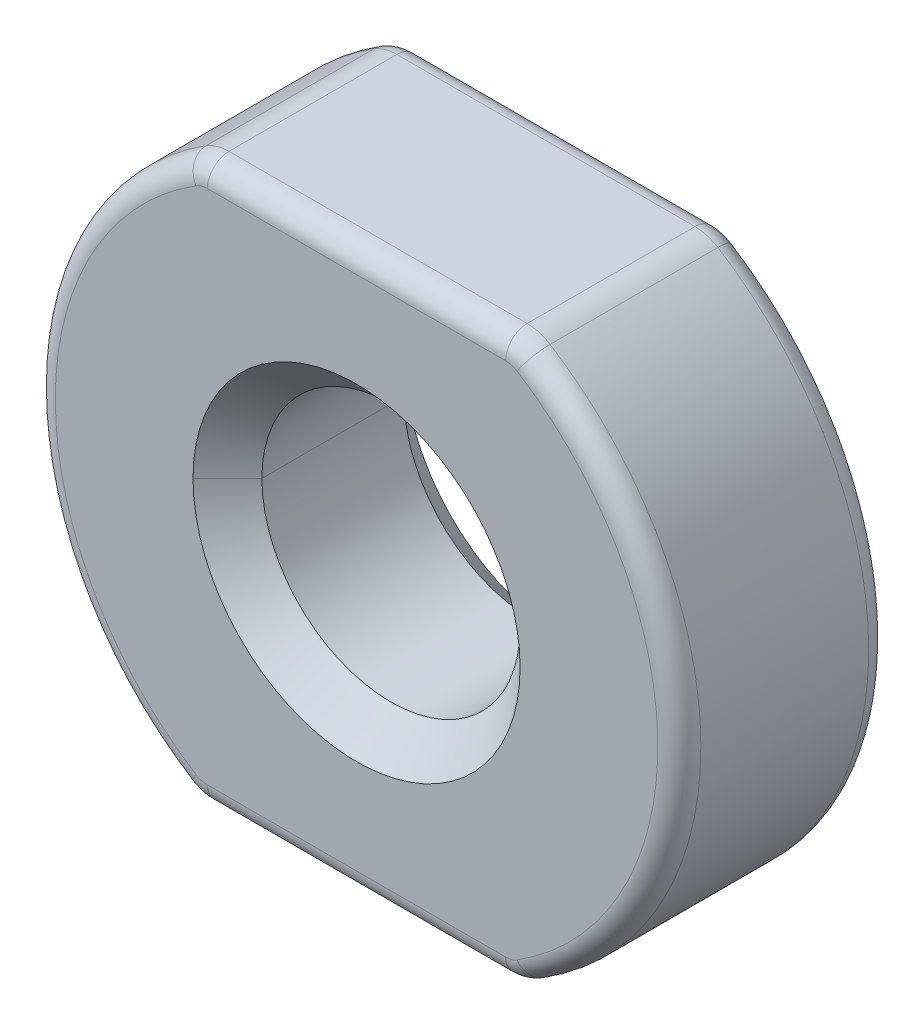
ISO-10303-21;
HEADER;
FILE_DESCRIPTION(('STEP AP214'),'2;1');
FILE_NAME('part.step','',(''),(''),'','','');
FILE_SCHEMA(('AUTOMOTIVE_DESIGN { 1 0 10303 214 1 1 1 1 }'));
ENDSEC;
DATA;
#1=APPLICATION_CONTEXT('core data for automotive mechanical design processes');
#2=APPLICATION_PROTOCOL_DEFINITION('international standard','automotive_design',2000,#1);
#3=PRODUCT_CONTEXT('',#1,'mechanical');
#4=PRODUCT('Part','Part','',(#3));
#5=PRODUCT_RELATED_PRODUCT_CATEGORY('part','',(#4));
#6=PRODUCT_DEFINITION_FORMATION('','',#4);
#7=PRODUCT_DEFINITION_CONTEXT('part definition',#1,'design');
#8=PRODUCT_DEFINITION('design','',#6,#7);
#9=PRODUCT_DEFINITION_SHAPE('','',#8);
#10=(LENGTH_UNIT() NAMED_UNIT(*) SI_UNIT(.MILLI.,.METRE.));
#11=(NAMED_UNIT(*) PLANE_ANGLE_UNIT() SI_UNIT($,.RADIAN.));
#12=(NAMED_UNIT(*) SI_UNIT($,.STERADIAN.) SOLID_ANGLE_UNIT());
#13=UNCERTAINTY_MEASURE_WITH_UNIT(LENGTH_MEASURE(1.E-05),#10,'distance_accuracy_value','');
#14=(GEOMETRIC_REPRESENTATION_CONTEXT(3) GLOBAL_UNCERTAINTY_ASSIGNED_CONTEXT((#13)) GLOBAL_UNIT_ASSIGNED_CONTEXT((#10,
#11,#12)) REPRESENTATION_CONTEXT('',''));
#15=CARTESIAN_POINT('',(0.,0.,0.));
#16=DIRECTION('',(0.,0.,1.));
#17=DIRECTION('',(1.,0.,0.));
#18=AXIS2_PLACEMENT_3D('',#15,#16,#17);
#19=CARTESIAN_POINT('',(-3.46410161513748,-5.49999999999987,0.499999999999376));
#20=DIRECTION('',(0.,0.,1.));
#21=DIRECTION('',(1.,0.,0.));
#22=AXIS2_PLACEMENT_3D('',#19,#20,#21);
#23=TOROIDAL_SURFACE('',#22,0.50000000000024,0.499999999999867);
#24=CARTESIAN_POINT('',(-3.46410161513748,-5.49999999999987,-4.90493062832442E-13));
#25=DIRECTION('',(0.,0.,1.));
#26=DIRECTION('',(1.,0.,0.));
#27=AXIS2_PLACEMENT_3D('',#24,#25,#26);
#28=CIRCLE('',#27,0.500000000000137);
#29=CARTESIAN_POINT('',(-3.73057097014816,-5.923076923077,0.));
#30=VERTEX_POINT('',#29);
#31=CARTESIAN_POINT('',(-3.46410161513774,-6.,-2.45246531416221E-13));
#32=VERTEX_POINT('',#31);
#33=EDGE_CURVE('E85',#30,#32,#28,.T.);
#34=ORIENTED_EDGE('',*,*,#33,.T.);
#35=CARTESIAN_POINT('',(-3.464101615138,-6.,0.5));
#36=DIRECTION('',(1.,0.,0.));
#37=DIRECTION('',(0.,0.,-1.));
#38=AXIS2_PLACEMENT_3D('',#35,#36,#37);
#39=CIRCLE('',#38,0.5);
#40=CARTESIAN_POINT('',(-3.464101615138,-6.5,0.5));
#41=VERTEX_POINT('',#40);
#42=EDGE_CURVE('E517',#41,#32,#39,.T.);
#43=ORIENTED_EDGE('',*,*,#42,.F.);
#44=CARTESIAN_POINT('',(-3.464101615138,-5.5,0.5));
#45=DIRECTION('',(0.,0.,-1.));
#46=DIRECTION('',(-1.,0.,0.));
#47=AXIS2_PLACEMENT_3D('',#44,#45,#46);
#48=CIRCLE('',#47,1.);
#49=CARTESIAN_POINT('',(-3.99704032515886,-6.34615384615394,0.5));
#50=VERTEX_POINT('',#49);
#51=EDGE_CURVE('E666',#50,#41,#48,.F.);
#52=ORIENTED_EDGE('',*,*,#51,.F.);
#53=CARTESIAN_POINT('',(-3.73057097014807,-5.9230769230771,0.5));
#54=DIRECTION('',(0.846153846153872,-0.532938710021153,0.));
#55=DIRECTION('',(-0.532938710021153,-0.846153846153872,0.));
#56=AXIS2_PLACEMENT_3D('',#53,#54,#55);
#57=CIRCLE('',#56,0.5);
#58=EDGE_CURVE('E550',#30,#50,#57,.F.);
#59=ORIENTED_EDGE('',*,*,#58,.F.);
#60=EDGE_LOOP('',(#34,#43,#52,#59));
#61=FACE_BOUND('',#60,.T.);
#62=ADVANCED_FACE('F17',(#61),#23,.T.);
#63=CARTESIAN_POINT('',(3.46410161513748,-5.49999999999987,0.499999999999523));
#64=DIRECTION('',(0.,0.,1.));
#65=DIRECTION('',(1.,0.,0.));
#66=AXIS2_PLACEMENT_3D('',#63,#64,#65);
#67=DEGENERATE_TOROIDAL_SURFACE('',#66,0.499999999999824,0.499999999999901,.T.);
#68=CARTESIAN_POINT('',(3.46410161513748,-5.49999999999987,-3.7773603689395E-13));
#69=DIRECTION('',(0.,0.,1.));
#70=DIRECTION('',(1.,0.,0.));
#71=AXIS2_PLACEMENT_3D('',#68,#69,#70);
#72=CIRCLE('',#71,0.500000000000134);
#73=CARTESIAN_POINT('',(3.46410161513774,-6.,-1.88868018446975E-13));
#74=VERTEX_POINT('',#73);
#75=CARTESIAN_POINT('',(3.7305709701482,-5.92307692307698,0.));
#76=VERTEX_POINT('',#75);
#77=EDGE_CURVE('E76',#74,#76,#72,.T.);
#78=ORIENTED_EDGE('',*,*,#77,.T.);
#79=CARTESIAN_POINT('',(3.73057097014832,-5.92307692307694,0.5));
#80=DIRECTION('',(0.846153846153849,0.532938710021189,0.));
#81=DIRECTION('',(0.532938710021189,-0.846153846153849,0.));
#82=AXIS2_PLACEMENT_3D('',#79,#80,#81);
#83=CIRCLE('',#82,0.5);
#84=CARTESIAN_POINT('',(3.99704032515893,-6.34615384615389,0.5));
#85=VERTEX_POINT('',#84);
#86=EDGE_CURVE('E475',#85,#76,#83,.T.);
#87=ORIENTED_EDGE('',*,*,#86,.F.);
#88=CARTESIAN_POINT('',(3.464101615138,-5.5,0.5));
#89=DIRECTION('',(0.,0.,-1.));
#90=DIRECTION('',(-1.,0.,0.));
#91=AXIS2_PLACEMENT_3D('',#88,#89,#90);
#92=CIRCLE('',#91,1.);
#93=CARTESIAN_POINT('',(3.464101615138,-6.5,0.5));
#94=VERTEX_POINT('',#93);
#95=EDGE_CURVE('E644',#94,#85,#92,.F.);
#96=ORIENTED_EDGE('',*,*,#95,.F.);
#97=CARTESIAN_POINT('',(3.464101615138,-6.,0.5));
#98=DIRECTION('',(1.,0.,0.));
#99=DIRECTION('',(0.,0.,-1.));
#100=AXIS2_PLACEMENT_3D('',#97,#98,#99);
#101=CIRCLE('',#100,0.5);
#102=EDGE_CURVE('E516',#74,#94,#101,.F.);
#103=ORIENTED_EDGE('',*,*,#102,.F.);
#104=EDGE_LOOP('',(#78,#87,#96,#103));
#105=FACE_BOUND('',#104,.T.);
#106=ADVANCED_FACE('F641',(#105),#67,.T.);
#107=CARTESIAN_POINT('',(-3.46410161513748,5.49999999999987,0.499999999999523));
#108=DIRECTION('',(0.,0.,1.));
#109=DIRECTION('',(1.,0.,0.));
#110=AXIS2_PLACEMENT_3D('',#107,#108,#109);
#111=DEGENERATE_TOROIDAL_SURFACE('',#110,0.499999999999824,0.499999999999901,.T.);
#112=CARTESIAN_POINT('',(-3.464101615138,5.5,0.5));
#113=DIRECTION('',(0.,0.,-1.));
#114=DIRECTION('',(-1.,0.,0.));
#115=AXIS2_PLACEMENT_3D('',#112,#113,#114);
#116=CIRCLE('',#115,1.);
#117=CARTESIAN_POINT('',(-3.464101615138,6.5,0.5));
#118=VERTEX_POINT('',#117);
#119=CARTESIAN_POINT('',(-3.99704032515893,6.34615384615389,0.5));
#120=VERTEX_POINT('',#119);
#121=EDGE_CURVE('E474',#118,#120,#116,.F.);
#122=ORIENTED_EDGE('',*,*,#121,.F.);
#123=CARTESIAN_POINT('',(-3.464101615138,6.,0.5));
#124=DIRECTION('',(-1.,0.,0.));
#125=DIRECTION('',(0.,0.,1.));
#126=AXIS2_PLACEMENT_3D('',#123,#124,#125);
#127=CIRCLE('',#126,0.5);
#128=CARTESIAN_POINT('',(-3.46410161513774,6.,-1.88868018446975E-13));
#129=VERTEX_POINT('',#128);
#130=EDGE_CURVE('E464',#129,#118,#127,.F.);
#131=ORIENTED_EDGE('',*,*,#130,.F.);
#132=CARTESIAN_POINT('',(-3.46410161513748,5.49999999999987,-3.7773603689395E-13));
#133=DIRECTION('',(0.,0.,1.));
#134=DIRECTION('',(1.,0.,0.));
#135=AXIS2_PLACEMENT_3D('',#132,#133,#134);
#136=CIRCLE('',#135,0.500000000000134);
#137=CARTESIAN_POINT('',(-3.73057097014815,5.92307692307701,0.));
#138=VERTEX_POINT('',#137);
#139=EDGE_CURVE('E601',#129,#138,#136,.T.);
#140=ORIENTED_EDGE('',*,*,#139,.T.);
#141=CARTESIAN_POINT('',(-3.73057097014832,5.92307692307694,0.5));
#142=DIRECTION('',(-0.846153846153849,-0.532938710021189,0.));
#143=DIRECTION('',(-0.532938710021189,0.846153846153849,0.));
#144=AXIS2_PLACEMENT_3D('',#141,#142,#143);
#145=CIRCLE('',#144,0.5);
#146=EDGE_CURVE('E552',#120,#138,#145,.T.);
#147=ORIENTED_EDGE('',*,*,#146,.F.);
#148=EDGE_LOOP('',(#122,#131,#140,#147));
#149=FACE_BOUND('',#148,.T.);
#150=ADVANCED_FACE('F604',(#149),#111,.T.);
#151=CARTESIAN_POINT('',(3.46410161513748,5.49999999999987,0.499999999999376));
#152=DIRECTION('',(0.,0.,1.));
#153=DIRECTION('',(1.,0.,0.));
#154=AXIS2_PLACEMENT_3D('',#151,#152,#153);
#155=TOROIDAL_SURFACE('',#154,0.50000000000024,0.499999999999867);
#156=CARTESIAN_POINT('',(3.464101615138,5.5,0.5));
#157=DIRECTION('',(0.,0.,-1.));
#158=DIRECTION('',(-1.,0.,0.));
#159=AXIS2_PLACEMENT_3D('',#156,#157,#158);
#160=CIRCLE('',#159,1.);
#161=CARTESIAN_POINT('',(3.99704032515886,6.34615384615394,0.5));
#162=VERTEX_POINT('',#161);
#163=CARTESIAN_POINT('',(3.464101615138,6.5,0.5));
#164=VERTEX_POINT('',#163);
#165=EDGE_CURVE('E450',#162,#164,#160,.F.);
#166=ORIENTED_EDGE('',*,*,#165,.F.);
#167=CARTESIAN_POINT('',(3.73057097014807,5.9230769230771,0.5));
#168=DIRECTION('',(-0.846153846153872,0.532938710021152,0.));
#169=DIRECTION('',(0.532938710021152,0.846153846153872,0.));
#170=AXIS2_PLACEMENT_3D('',#167,#168,#169);
#171=CIRCLE('',#170,0.5);
#172=CARTESIAN_POINT('',(3.7305709701481,5.92307692307699,0.));
#173=VERTEX_POINT('',#172);
#174=EDGE_CURVE('E488',#173,#162,#171,.F.);
#175=ORIENTED_EDGE('',*,*,#174,.F.);
#176=CARTESIAN_POINT('',(3.46410161513748,5.49999999999987,-4.90493062832442E-13));
#177=DIRECTION('',(0.,0.,1.));
#178=DIRECTION('',(1.,0.,0.));
#179=AXIS2_PLACEMENT_3D('',#176,#177,#178);
#180=CIRCLE('',#179,0.500000000000137);
#181=CARTESIAN_POINT('',(3.46410161513774,6.,-2.45246531416221E-13));
#182=VERTEX_POINT('',#181);
#183=EDGE_CURVE('E599',#173,#182,#180,.T.);
#184=ORIENTED_EDGE('',*,*,#183,.T.);
#185=CARTESIAN_POINT('',(3.464101615138,6.,0.5));
#186=DIRECTION('',(-1.,0.,0.));
#187=DIRECTION('',(0.,0.,1.));
#188=AXIS2_PLACEMENT_3D('',#185,#186,#187);
#189=CIRCLE('',#188,0.5);
#190=EDGE_CURVE('E451',#164,#182,#189,.T.);
#191=ORIENTED_EDGE('',*,*,#190,.F.);
#192=EDGE_LOOP('',(#166,#175,#184,#191));
#193=FACE_BOUND('',#192,.T.);
#194=ADVANCED_FACE('F712',(#193),#155,.T.);
#195=CARTESIAN_POINT('',(0.,0.,0.));
#196=DIRECTION('',(0.,0.,1.));
#197=DIRECTION('',(1.,0.,0.));
#198=AXIS2_PLACEMENT_3D('',#195,#196,#197);
#199=PLANE('',#198);
#200=CARTESIAN_POINT('',(0.,0.,0.));
#201=DIRECTION('',(0.,0.,-1.));
#202=DIRECTION('',(-1.,0.,0.));
#203=AXIS2_PLACEMENT_3D('',#200,#201,#202);
#204=CIRCLE('',#203,3.80000000001246);
#205=CARTESIAN_POINT('',(3.80000000001246,0.,0.));
#206=VERTEX_POINT('',#205);
#207=CARTESIAN_POINT('',(-3.80000000001246,0.,0.));
#208=VERTEX_POINT('',#207);
#209=EDGE_CURVE('E445',#206,#208,#204,.F.);
#210=ORIENTED_EDGE('',*,*,#209,.T.);
#211=CARTESIAN_POINT('',(0.,0.,0.));
#212=DIRECTION('',(0.,0.,-1.));
#213=DIRECTION('',(-1.,0.,0.));
#214=AXIS2_PLACEMENT_3D('',#211,#212,#213);
#215=CIRCLE('',#214,3.80000000001246);
#216=EDGE_CURVE('E439',#208,#206,#215,.F.);
#217=ORIENTED_EDGE('',*,*,#216,.T.);
#218=EDGE_LOOP('',(#210,#217));
#219=FACE_BOUND('',#218,.T.);
#220=CARTESIAN_POINT('',(0.,0.,0.));
#221=DIRECTION('',(0.,0.,1.));
#222=DIRECTION('',(-0.532938710021177,0.846153846153856,0.));
#223=AXIS2_PLACEMENT_3D('',#220,#221,#222);
#224=CIRCLE('',#223,6.99999999999988);
#225=CARTESIAN_POINT('',(-7.,0.,0.));
#226=VERTEX_POINT('',#225);
#227=EDGE_CURVE('E576',#138,#226,#224,.T.);
#228=ORIENTED_EDGE('',*,*,#227,.F.);
#229=ORIENTED_EDGE('',*,*,#139,.F.);
#230=DIRECTION('',(-1.,0.,0.));
#231=VECTOR('',#230,1.);
#232=CARTESIAN_POINT('',(-3.741657386774,6.,0.));
#233=LINE('',#232,#231);
#234=EDGE_CURVE('E469',#182,#129,#233,.T.);
#235=ORIENTED_EDGE('',*,*,#234,.F.);
#236=ORIENTED_EDGE('',*,*,#183,.F.);
#237=CARTESIAN_POINT('',(0.,0.,0.));
#238=DIRECTION('',(0.,0.,1.));
#239=DIRECTION('',(0.532938710021187,-0.84615384615385,0.));
#240=AXIS2_PLACEMENT_3D('',#237,#238,#239);
#241=CIRCLE('',#240,6.99999999999988);
#242=EDGE_CURVE('E564',#76,#173,#241,.T.);
#243=ORIENTED_EDGE('',*,*,#242,.F.);
#244=ORIENTED_EDGE('',*,*,#77,.F.);
#245=DIRECTION('',(1.,0.,0.));
#246=VECTOR('',#245,1.);
#247=CARTESIAN_POINT('',(-3.741657386774,-6.,0.));
#248=LINE('',#247,#246);
#249=EDGE_CURVE('E508',#32,#74,#248,.T.);
#250=ORIENTED_EDGE('',*,*,#249,.F.);
#251=ORIENTED_EDGE('',*,*,#33,.F.);
#252=CARTESIAN_POINT('',(0.,0.,0.));
#253=DIRECTION('',(0.,0.,1.));
#254=DIRECTION('',(-1.,0.,0.));
#255=AXIS2_PLACEMENT_3D('',#252,#253,#254);
#256=CIRCLE('',#255,7.);
#257=EDGE_CURVE('E523',#226,#30,#256,.T.);
#258=ORIENTED_EDGE('',*,*,#257,.F.);
#259=EDGE_LOOP('',(#228,#229,#235,#236,#243,#244,#250,#251,#258));
#260=FACE_BOUND('',#259,.T.);
#261=ADVANCED_FACE('F541',(#219,#260),#199,.F.);
#262=CARTESIAN_POINT('',(0.,0.,0.5));
#263=DIRECTION('',(0.,0.,1.));
#264=DIRECTION('',(1.,0.,0.));
#265=AXIS2_PLACEMENT_3D('',#262,#263,#264);
#266=TOROIDAL_SURFACE('',#265,7.,0.5);
#267=CARTESIAN_POINT('',(0.,0.,0.5));
#268=DIRECTION('',(0.,0.,-1.));
#269=DIRECTION('',(-1.,0.,0.));
#270=AXIS2_PLACEMENT_3D('',#267,#268,#269);
#271=CIRCLE('',#270,7.5);
#272=CARTESIAN_POINT('',(-7.5,0.,0.5));
#273=VERTEX_POINT('',#272);
#274=EDGE_CURVE('E427',#120,#273,#271,.F.);
#275=ORIENTED_EDGE('',*,*,#274,.F.);
#276=ORIENTED_EDGE('',*,*,#146,.T.);
#277=ORIENTED_EDGE('',*,*,#227,.T.);
#278=ORIENTED_EDGE('',*,*,#257,.T.);
#279=ORIENTED_EDGE('',*,*,#58,.T.);
#280=CARTESIAN_POINT('',(0.,0.,0.5));
#281=DIRECTION('',(0.,0.,-1.));
#282=DIRECTION('',(-1.,0.,0.));
#283=AXIS2_PLACEMENT_3D('',#280,#281,#282);
#284=CIRCLE('',#283,7.5);
#285=EDGE_CURVE('E421',#273,#50,#284,.F.);
#286=ORIENTED_EDGE('',*,*,#285,.F.);
#287=EDGE_LOOP('',(#275,#276,#277,#278,#279,#286));
#288=FACE_BOUND('',#287,.T.);
#289=ADVANCED_FACE('F529',(#288),#266,.T.);
#290=CARTESIAN_POINT('',(-3.741657386774,-6.,0.5));
#291=DIRECTION('',(1.,0.,0.));
#292=DIRECTION('',(0.,0.,-1.));
#293=AXIS2_PLACEMENT_3D('',#290,#291,#292);
#294=CYLINDRICAL_SURFACE('',#293,0.5);
#295=ORIENTED_EDGE('',*,*,#249,.T.);
#296=ORIENTED_EDGE('',*,*,#102,.T.);
#297=DIRECTION('',(1.,0.,0.));
#298=VECTOR('',#297,1.);
#299=CARTESIAN_POINT('',(-3.741657386774,-6.5,0.5));
#300=LINE('',#299,#298);
#301=EDGE_CURVE('E408',#94,#41,#300,.F.);
#302=ORIENTED_EDGE('',*,*,#301,.T.);
#303=ORIENTED_EDGE('',*,*,#42,.T.);
#304=EDGE_LOOP('',(#295,#296,#302,#303));
#305=FACE_BOUND('',#304,.T.);
#306=ADVANCED_FACE('F540',(#305),#294,.T.);
#307=CARTESIAN_POINT('',(-3.464101615138,-5.5,4.9));
#308=DIRECTION('',(0.,0.,-1.));
#309=DIRECTION('',(-1.,0.,0.));
#310=AXIS2_PLACEMENT_3D('',#307,#308,#309);
#311=CYLINDRICAL_SURFACE('',#310,1.);
#312=ORIENTED_EDGE('',*,*,#51,.T.);
#313=DIRECTION('',(0.,0.,1.));
#314=VECTOR('',#313,1.);
#315=CARTESIAN_POINT('',(-3.464101615138,-6.5,4.9));
#316=LINE('',#315,#314);
#317=CARTESIAN_POINT('',(-3.464101615138,-6.5,4.4));
#318=VERTEX_POINT('',#317);
#319=EDGE_CURVE('E398',#41,#318,#316,.T.);
#320=ORIENTED_EDGE('',*,*,#319,.T.);
#321=CARTESIAN_POINT('',(-3.464101615138,-5.5,4.4));
#322=DIRECTION('',(0.,0.,-1.));
#323=DIRECTION('',(-1.,0.,0.));
#324=AXIS2_PLACEMENT_3D('',#321,#322,#323);
#325=CIRCLE('',#324,1.);
#326=CARTESIAN_POINT('',(-3.99704032515865,-6.3461538461542,4.4));
#327=VERTEX_POINT('',#326);
#328=EDGE_CURVE('E648',#318,#327,#325,.T.);
#329=ORIENTED_EDGE('',*,*,#328,.T.);
#330=DIRECTION('',(0.,0.,-1.));
#331=VECTOR('',#330,1.);
#332=CARTESIAN_POINT('',(-3.99704032515892,-6.34615384615387,4.9));
#333=LINE('',#332,#331);
#334=EDGE_CURVE('E409',#50,#327,#333,.F.);
#335=ORIENTED_EDGE('',*,*,#334,.F.);
#336=EDGE_LOOP('',(#312,#320,#329,#335));
#337=FACE_BOUND('',#336,.T.);
#338=ADVANCED_FACE('F665',(#337),#311,.T.);
#339=CARTESIAN_POINT('',(3.464101615138,-5.5,4.9));
#340=DIRECTION('',(0.,0.,-1.));
#341=DIRECTION('',(-1.,0.,0.));
#342=AXIS2_PLACEMENT_3D('',#339,#340,#341);
#343=CYLINDRICAL_SURFACE('',#342,1.);
#344=ORIENTED_EDGE('',*,*,#95,.T.);
#345=DIRECTION('',(0.,0.,-1.));
#346=VECTOR('',#345,1.);
#347=CARTESIAN_POINT('',(3.99704032515892,-6.34615384615387,4.9));
#348=LINE('',#347,#346);
#349=CARTESIAN_POINT('',(3.9970403251588,-6.34615384615398,4.4));
#350=VERTEX_POINT('',#349);
#351=EDGE_CURVE('E394',#350,#85,#348,.T.);
#352=ORIENTED_EDGE('',*,*,#351,.F.);
#353=CARTESIAN_POINT('',(3.464101615138,-5.5,4.4));
#354=DIRECTION('',(0.,0.,-1.));
#355=DIRECTION('',(-1.,0.,0.));
#356=AXIS2_PLACEMENT_3D('',#353,#354,#355);
#357=CIRCLE('',#356,1.);
#358=CARTESIAN_POINT('',(3.46410161513785,-6.50000000000008,4.4));
#359=VERTEX_POINT('',#358);
#360=EDGE_CURVE('E671',#350,#359,#357,.T.);
#361=ORIENTED_EDGE('',*,*,#360,.T.);
#362=DIRECTION('',(0.,0.,1.));
#363=VECTOR('',#362,1.);
#364=CARTESIAN_POINT('',(3.464101615138,-6.5,4.9));
#365=LINE('',#364,#363);
#366=EDGE_CURVE('E405',#359,#94,#365,.F.);
#367=ORIENTED_EDGE('',*,*,#366,.T.);
#368=EDGE_LOOP('',(#344,#352,#361,#367));
#369=FACE_BOUND('',#368,.T.);
#370=ADVANCED_FACE('F497',(#369),#343,.T.);
#371=CARTESIAN_POINT('',(0.,0.,0.5));
#372=DIRECTION('',(0.,0.,1.));
#373=DIRECTION('',(1.,0.,0.));
#374=AXIS2_PLACEMENT_3D('',#371,#372,#373);
#375=TOROIDAL_SURFACE('',#374,7.,0.5);
#376=CARTESIAN_POINT('',(0.,0.,0.5));
#377=DIRECTION('',(0.,0.,-1.));
#378=DIRECTION('',(-1.,0.,0.));
#379=AXIS2_PLACEMENT_3D('',#376,#377,#378);
#380=CIRCLE('',#379,7.5);
#381=CARTESIAN_POINT('',(7.5,0.,0.5));
#382=VERTEX_POINT('',#381);
#383=EDGE_CURVE('E397',#85,#382,#380,.F.);
#384=ORIENTED_EDGE('',*,*,#383,.F.);
#385=ORIENTED_EDGE('',*,*,#86,.T.);
#386=ORIENTED_EDGE('',*,*,#242,.T.);
#387=ORIENTED_EDGE('',*,*,#174,.T.);
#388=CARTESIAN_POINT('',(0.,0.,0.5));
#389=DIRECTION('',(0.,0.,-1.));
#390=DIRECTION('',(-1.,0.,0.));
#391=AXIS2_PLACEMENT_3D('',#388,#389,#390);
#392=CIRCLE('',#391,7.5);
#393=EDGE_CURVE('E391',#382,#162,#392,.F.);
#394=ORIENTED_EDGE('',*,*,#393,.F.);
#395=EDGE_LOOP('',(#384,#385,#386,#387,#394));
#396=FACE_BOUND('',#395,.T.);
#397=ADVANCED_FACE('F491',(#396),#375,.T.);
#398=CARTESIAN_POINT('',(-3.464101615138,5.5,4.9));
#399=DIRECTION('',(0.,0.,-1.));
#400=DIRECTION('',(-1.,0.,0.));
#401=AXIS2_PLACEMENT_3D('',#398,#399,#400);
#402=CYLINDRICAL_SURFACE('',#401,1.);
#403=ORIENTED_EDGE('',*,*,#121,.T.);
#404=DIRECTION('',(0.,0.,-1.));
#405=VECTOR('',#404,1.);
#406=CARTESIAN_POINT('',(-3.99704032515892,6.34615384615387,4.9));
#407=LINE('',#406,#405);
#408=CARTESIAN_POINT('',(-3.99704032515895,6.34615384615401,4.4));
#409=VERTEX_POINT('',#408);
#410=EDGE_CURVE('E424',#409,#120,#407,.T.);
#411=ORIENTED_EDGE('',*,*,#410,.F.);
#412=CARTESIAN_POINT('',(-3.464101615138,5.5,4.4));
#413=DIRECTION('',(0.,0.,-1.));
#414=DIRECTION('',(-1.,0.,0.));
#415=AXIS2_PLACEMENT_3D('',#412,#413,#414);
#416=CIRCLE('',#415,1.);
#417=CARTESIAN_POINT('',(-3.46410161513785,6.50000000000008,4.4));
#418=VERTEX_POINT('',#417);
#419=EDGE_CURVE('E472',#409,#418,#416,.T.);
#420=ORIENTED_EDGE('',*,*,#419,.T.);
#421=DIRECTION('',(0.,0.,-1.));
#422=VECTOR('',#421,1.);
#423=CARTESIAN_POINT('',(-3.464101615138,6.5,4.9));
#424=LINE('',#423,#422);
#425=EDGE_CURVE('E375',#418,#118,#424,.T.);
#426=ORIENTED_EDGE('',*,*,#425,.T.);
#427=EDGE_LOOP('',(#403,#411,#420,#426));
#428=FACE_BOUND('',#427,.T.);
#429=ADVANCED_FACE('F496',(#428),#402,.T.);
#430=CARTESIAN_POINT('',(-3.741657386774,6.,0.5));
#431=DIRECTION('',(-1.,0.,0.));
#432=DIRECTION('',(0.,0.,1.));
#433=AXIS2_PLACEMENT_3D('',#430,#431,#432);
#434=CYLINDRICAL_SURFACE('',#433,0.5);
#435=DIRECTION('',(1.,0.,0.));
#436=VECTOR('',#435,1.);
#437=CARTESIAN_POINT('',(-3.741657386774,6.5,0.5));
#438=LINE('',#437,#436);
#439=EDGE_CURVE('E372',#118,#164,#438,.T.);
#440=ORIENTED_EDGE('',*,*,#439,.T.);
#441=ORIENTED_EDGE('',*,*,#190,.T.);
#442=ORIENTED_EDGE('',*,*,#234,.T.);
#443=ORIENTED_EDGE('',*,*,#130,.T.);
#444=EDGE_LOOP('',(#440,#441,#442,#443));
#445=FACE_BOUND('',#444,.T.);
#446=ADVANCED_FACE('F596',(#445),#434,.T.);
#447=CARTESIAN_POINT('',(3.464101615138,5.5,4.9));
#448=DIRECTION('',(0.,0.,-1.));
#449=DIRECTION('',(-1.,0.,0.));
#450=AXIS2_PLACEMENT_3D('',#447,#448,#449);
#451=CYLINDRICAL_SURFACE('',#450,1.);
#452=ORIENTED_EDGE('',*,*,#165,.T.);
#453=DIRECTION('',(0.,0.,-1.));
#454=VECTOR('',#453,1.);
#455=CARTESIAN_POINT('',(3.464101615138,6.5,4.9));
#456=LINE('',#455,#454);
#457=CARTESIAN_POINT('',(3.464101615138,6.5,4.4));
#458=VERTEX_POINT('',#457);
#459=EDGE_CURVE('E369',#164,#458,#456,.F.);
#460=ORIENTED_EDGE('',*,*,#459,.T.);
#461=CARTESIAN_POINT('',(3.464101615138,5.5,4.4));
#462=DIRECTION('',(0.,0.,-1.));
#463=DIRECTION('',(-1.,0.,0.));
#464=AXIS2_PLACEMENT_3D('',#461,#462,#463);
#465=CIRCLE('',#464,1.);
#466=CARTESIAN_POINT('',(3.99704032515865,6.3461538461542,4.4));
#467=VERTEX_POINT('',#466);
#468=EDGE_CURVE('E448',#458,#467,#465,.T.);
#469=ORIENTED_EDGE('',*,*,#468,.T.);
#470=DIRECTION('',(0.,0.,-1.));
#471=VECTOR('',#470,1.);
#472=CARTESIAN_POINT('',(3.99704032515892,6.34615384615387,4.9));
#473=LINE('',#472,#471);
#474=EDGE_CURVE('E378',#162,#467,#473,.F.);
#475=ORIENTED_EDGE('',*,*,#474,.F.);
#476=EDGE_LOOP('',(#452,#460,#469,#475));
#477=FACE_BOUND('',#476,.T.);
#478=ADVANCED_FACE('F700',(#477),#451,.T.);
#479=CARTESIAN_POINT('',(0.,0.,0.));
#480=DIRECTION('',(0.,0.,-1.));
#481=DIRECTION('',(-1.,0.,0.));
#482=AXIS2_PLACEMENT_3D('',#479,#480,#481);
#483=CONICAL_SURFACE('',#482,3.80000000001246,0.785398163397448);
#484=ORIENTED_EDGE('',*,*,#209,.F.);
#485=DIRECTION('',(-0.707106781186443,0.,0.707106781186652));
#486=VECTOR('',#485,1.);
#487=CARTESIAN_POINT('',(499000.,6.11078570557366E-11,-498996.200000148));
#488=LINE('',#487,#486);
#489=CARTESIAN_POINT('',(3.00000000001069,0.,0.799999999992429));
#490=VERTEX_POINT('',#489);
#491=EDGE_CURVE('E428',#206,#490,#488,.T.);
#492=ORIENTED_EDGE('',*,*,#491,.T.);
#493=CARTESIAN_POINT('',(0.,0.,0.8));
#494=DIRECTION('',(0.,0.,-1.));
#495=DIRECTION('',(-1.,0.,0.));
#496=AXIS2_PLACEMENT_3D('',#493,#494,#495);
#497=CIRCLE('',#496,3.);
#498=CARTESIAN_POINT('',(-3.00000000001069,0.,0.799999999992429));
#499=VERTEX_POINT('',#498);
#500=EDGE_CURVE('E358',#490,#499,#497,.F.);
#501=ORIENTED_EDGE('',*,*,#500,.T.);
#502=DIRECTION('',(0.707106781186443,0.,0.707106781186652));
#503=VECTOR('',#502,1.);
#504=CARTESIAN_POINT('',(-499000.,0.,-498996.200000148));
#505=LINE('',#504,#503);
#506=EDGE_CURVE('E442',#499,#208,#505,.F.);
#507=ORIENTED_EDGE('',*,*,#506,.T.);
#508=EDGE_LOOP('',(#484,#492,#501,#507));
#509=FACE_BOUND('',#508,.T.);
#510=ADVANCED_FACE('F793',(#509),#483,.F.);
#511=CARTESIAN_POINT('',(0.,0.,0.));
#512=DIRECTION('',(0.,0.,-1.));
#513=DIRECTION('',(-1.,0.,0.));
#514=AXIS2_PLACEMENT_3D('',#511,#512,#513);
#515=CONICAL_SURFACE('',#514,3.80000000001246,0.785398163397448);
#516=ORIENTED_EDGE('',*,*,#216,.F.);
#517=ORIENTED_EDGE('',*,*,#506,.F.);
#518=CARTESIAN_POINT('',(0.,0.,0.8));
#519=DIRECTION('',(0.,0.,-1.));
#520=DIRECTION('',(-1.,0.,0.));
#521=AXIS2_PLACEMENT_3D('',#518,#519,#520);
#522=CIRCLE('',#521,3.);
#523=EDGE_CURVE('E352',#499,#490,#522,.F.);
#524=ORIENTED_EDGE('',*,*,#523,.T.);
#525=ORIENTED_EDGE('',*,*,#491,.F.);
#526=EDGE_LOOP('',(#516,#517,#524,#525));
#527=FACE_BOUND('',#526,.T.);
#528=ADVANCED_FACE('F801',(#527),#515,.F.);
#529=CARTESIAN_POINT('',(0.,0.,4.9));
#530=DIRECTION('',(0.,0.,-1.));
#531=DIRECTION('',(-1.,0.,0.));
#532=AXIS2_PLACEMENT_3D('',#529,#530,#531);
#533=CYLINDRICAL_SURFACE('',#532,7.5);
#534=ORIENTED_EDGE('',*,*,#285,.T.);
#535=ORIENTED_EDGE('',*,*,#334,.T.);
#536=CARTESIAN_POINT('',(0.,0.,4.4));
#537=DIRECTION('',(0.,0.,1.));
#538=DIRECTION('',(1.,0.,0.));
#539=AXIS2_PLACEMENT_3D('',#536,#537,#538);
#540=CIRCLE('',#539,7.5);
#541=CARTESIAN_POINT('',(-7.5,0.,4.4));
#542=VERTEX_POINT('',#541);
#543=EDGE_CURVE('E321',#542,#327,#540,.T.);
#544=ORIENTED_EDGE('',*,*,#543,.F.);
#545=CARTESIAN_POINT('',(0.,0.,4.4));
#546=DIRECTION('',(0.,0.,1.));
#547=DIRECTION('',(1.,0.,0.));
#548=AXIS2_PLACEMENT_3D('',#545,#546,#547);
#549=CIRCLE('',#548,7.5);
#550=EDGE_CURVE('E351',#409,#542,#549,.T.);
#551=ORIENTED_EDGE('',*,*,#550,.F.);
#552=ORIENTED_EDGE('',*,*,#410,.T.);
#553=ORIENTED_EDGE('',*,*,#274,.T.);
#554=EDGE_LOOP('',(#534,#535,#544,#551,#552,#553));
#555=FACE_BOUND('',#554,.T.);
#556=ADVANCED_FACE('F662',(#555),#533,.T.);
#557=CARTESIAN_POINT('',(-3.741657386774,-6.5,4.9));
#558=DIRECTION('',(0.,1.,0.));
#559=DIRECTION('',(0.,0.,1.));
#560=AXIS2_PLACEMENT_3D('',#557,#558,#559);
#561=PLANE('',#560);
#562=ORIENTED_EDGE('',*,*,#319,.F.);
#563=ORIENTED_EDGE('',*,*,#301,.F.);
#564=ORIENTED_EDGE('',*,*,#366,.F.);
#565=DIRECTION('',(-1.,0.,0.));
#566=VECTOR('',#565,1.);
#567=CARTESIAN_POINT('',(0.,-6.5,4.4));
#568=LINE('',#567,#566);
#569=EDGE_CURVE('E312',#318,#359,#568,.F.);
#570=ORIENTED_EDGE('',*,*,#569,.F.);
#571=EDGE_LOOP('',(#562,#563,#564,#570));
#572=FACE_BOUND('',#571,.T.);
#573=ADVANCED_FACE('F818',(#572),#561,.F.);
#574=CARTESIAN_POINT('',(0.,0.,4.9));
#575=DIRECTION('',(0.,0.,-1.));
#576=DIRECTION('',(-1.,0.,0.));
#577=AXIS2_PLACEMENT_3D('',#574,#575,#576);
#578=CYLINDRICAL_SURFACE('',#577,7.5);
#579=ORIENTED_EDGE('',*,*,#393,.T.);
#580=ORIENTED_EDGE('',*,*,#474,.T.);
#581=CARTESIAN_POINT('',(0.,0.,4.4));
#582=DIRECTION('',(0.,0.,1.));
#583=DIRECTION('',(1.,0.,0.));
#584=AXIS2_PLACEMENT_3D('',#581,#582,#583);
#585=CIRCLE('',#584,7.5);
#586=CARTESIAN_POINT('',(7.5,0.,4.4));
#587=VERTEX_POINT('',#586);
#588=EDGE_CURVE('E305',#587,#467,#585,.T.);
#589=ORIENTED_EDGE('',*,*,#588,.F.);
#590=CARTESIAN_POINT('',(0.,0.,4.4));
#591=DIRECTION('',(0.,0.,1.));
#592=DIRECTION('',(1.,0.,0.));
#593=AXIS2_PLACEMENT_3D('',#590,#591,#592);
#594=CIRCLE('',#593,7.5);
#595=EDGE_CURVE('E311',#350,#587,#594,.T.);
#596=ORIENTED_EDGE('',*,*,#595,.F.);
#597=ORIENTED_EDGE('',*,*,#351,.T.);
#598=ORIENTED_EDGE('',*,*,#383,.T.);
#599=EDGE_LOOP('',(#579,#580,#589,#596,#597,#598));
#600=FACE_BOUND('',#599,.T.);
#601=ADVANCED_FACE('F693',(#600),#578,.T.);
#602=CARTESIAN_POINT('',(-3.741657386774,6.5,4.9));
#603=DIRECTION('',(0.,-1.,0.));
#604=DIRECTION('',(0.,0.,-1.));
#605=AXIS2_PLACEMENT_3D('',#602,#603,#604);
#606=PLANE('',#605);
#607=ORIENTED_EDGE('',*,*,#459,.F.);
#608=ORIENTED_EDGE('',*,*,#439,.F.);
#609=ORIENTED_EDGE('',*,*,#425,.F.);
#610=DIRECTION('',(1.,0.,0.));
#611=VECTOR('',#610,1.);
#612=CARTESIAN_POINT('',(0.,6.5,4.4));
#613=LINE('',#612,#611);
#614=EDGE_CURVE('E271',#458,#418,#613,.F.);
#615=ORIENTED_EDGE('',*,*,#614,.F.);
#616=EDGE_LOOP('',(#607,#608,#609,#615));
#617=FACE_BOUND('',#616,.T.);
#618=ADVANCED_FACE('F612',(#617),#606,.F.);
#619=CARTESIAN_POINT('',(0.,0.,4.9));
#620=DIRECTION('',(0.,0.,-1.));
#621=DIRECTION('',(-1.,0.,0.));
#622=AXIS2_PLACEMENT_3D('',#619,#620,#621);
#623=CYLINDRICAL_SURFACE('',#622,3.);
#624=ORIENTED_EDGE('',*,*,#500,.F.);
#625=DIRECTION('',(0.,0.,-1.));
#626=VECTOR('',#625,1.);
#627=CARTESIAN_POINT('',(3.,0.,4.9));
#628=LINE('',#627,#626);
#629=CARTESIAN_POINT('',(3.00000000003206,0.,4.0999999999955));
#630=VERTEX_POINT('',#629);
#631=EDGE_CURVE('E349',#490,#630,#628,.F.);
#632=ORIENTED_EDGE('',*,*,#631,.T.);
#633=CARTESIAN_POINT('',(0.,0.,4.099999999994));
#634=DIRECTION('',(0.,0.,1.));
#635=DIRECTION('',(1.,0.,0.));
#636=AXIS2_PLACEMENT_3D('',#633,#634,#635);
#637=CIRCLE('',#636,3.00000000004274);
#638=CARTESIAN_POINT('',(-3.00000000003206,0.,4.099999999994));
#639=VERTEX_POINT('',#638);
#640=EDGE_CURVE('E256',#630,#639,#637,.T.);
#641=ORIENTED_EDGE('',*,*,#640,.T.);
#642=DIRECTION('',(0.,0.,-1.));
#643=VECTOR('',#642,1.);
#644=CARTESIAN_POINT('',(-3.,0.,4.9));
#645=LINE('',#644,#643);
#646=EDGE_CURVE('E355',#639,#499,#645,.T.);
#647=ORIENTED_EDGE('',*,*,#646,.T.);
#648=EDGE_LOOP('',(#624,#632,#641,#647));
#649=FACE_BOUND('',#648,.T.);
#650=ADVANCED_FACE('F841',(#649),#623,.F.);
#651=CARTESIAN_POINT('',(0.,0.,4.9));
#652=DIRECTION('',(0.,0.,-1.));
#653=DIRECTION('',(-1.,0.,0.));
#654=AXIS2_PLACEMENT_3D('',#651,#652,#653);
#655=CYLINDRICAL_SURFACE('',#654,3.);
#656=ORIENTED_EDGE('',*,*,#523,.F.);
#657=ORIENTED_EDGE('',*,*,#646,.F.);
#658=CARTESIAN_POINT('',(0.,0.,4.099999999994));
#659=DIRECTION('',(0.,0.,1.));
#660=DIRECTION('',(1.,0.,0.));
#661=AXIS2_PLACEMENT_3D('',#658,#659,#660);
#662=CIRCLE('',#661,3.00000000004274);
#663=EDGE_CURVE('E250',#639,#630,#662,.T.);
#664=ORIENTED_EDGE('',*,*,#663,.T.);
#665=ORIENTED_EDGE('',*,*,#631,.F.);
#666=EDGE_LOOP('',(#656,#657,#664,#665));
#667=FACE_BOUND('',#666,.T.);
#668=ADVANCED_FACE('F328',(#667),#655,.F.);
#669=CARTESIAN_POINT('',(0.,0.,4.4));
#670=DIRECTION('',(0.,0.,1.));
#671=DIRECTION('',(1.,0.,0.));
#672=AXIS2_PLACEMENT_3D('',#669,#670,#671);
#673=TOROIDAL_SURFACE('',#672,7.,0.5);
#674=CARTESIAN_POINT('',(0.,0.,4.9));
#675=DIRECTION('',(0.,0.,-1.));
#676=DIRECTION('',(-1.,0.,0.));
#677=AXIS2_PLACEMENT_3D('',#674,#675,#676);
#678=CIRCLE('',#677,7.);
#679=CARTESIAN_POINT('',(-3.73057097014825,5.92307692307705,4.89999999999991));
#680=VERTEX_POINT('',#679);
#681=CARTESIAN_POINT('',(-7.,0.,4.9));
#682=VERTEX_POINT('',#681);
#683=EDGE_CURVE('E183',#680,#682,#678,.F.);
#684=ORIENTED_EDGE('',*,*,#683,.F.);
#685=CARTESIAN_POINT('',(-3.73057097014865,5.92307692307751,4.39999999999975));
#686=DIRECTION('',(0.846153846153922,0.532938710021072,3.36634254047422E-13));
#687=DIRECTION('',(-0.532938710021072,0.846153846153922,0.));
#688=AXIS2_PLACEMENT_3D('',#685,#686,#687);
#689=CIRCLE('',#688,0.499999999999764);
#690=EDGE_CURVE('E259',#409,#680,#689,.T.);
#691=ORIENTED_EDGE('',*,*,#690,.F.);
#692=ORIENTED_EDGE('',*,*,#550,.T.);
#693=ORIENTED_EDGE('',*,*,#543,.T.);
#694=CARTESIAN_POINT('',(-3.73057097014835,-5.9230769230777,4.39999999999975));
#695=DIRECTION('',(0.846153846154301,-0.532938710020471,3.37770846247268E-13));
#696=DIRECTION('',(0.532938710020471,0.846153846154301,0.));
#697=AXIS2_PLACEMENT_3D('',#694,#695,#696);
#698=CIRCLE('',#697,0.499999999999764);
#699=CARTESIAN_POINT('',(-3.73057097014819,-5.92307692307713,4.89999999999991));
#700=VERTEX_POINT('',#699);
#701=EDGE_CURVE('E188',#700,#327,#698,.T.);
#702=ORIENTED_EDGE('',*,*,#701,.F.);
#703=CARTESIAN_POINT('',(0.,0.,4.9));
#704=DIRECTION('',(0.,0.,-1.));
#705=DIRECTION('',(-0.532938710021187,-0.84615384615385,0.));
#706=AXIS2_PLACEMENT_3D('',#703,#704,#705);
#707=CIRCLE('',#706,6.99999999999994);
#708=EDGE_CURVE('E178',#682,#700,#707,.F.);
#709=ORIENTED_EDGE('',*,*,#708,.F.);
#710=EDGE_LOOP('',(#684,#691,#692,#693,#702,#709));
#711=FACE_BOUND('',#710,.T.);
#712=ADVANCED_FACE('F181',(#711),#673,.T.);
#713=CARTESIAN_POINT('',(-3.46410161513819,-5.49999999999962,4.40000000000013));
#714=DIRECTION('',(0.,0.,1.));
#715=DIRECTION('',(1.,0.,0.));
#716=AXIS2_PLACEMENT_3D('',#713,#714,#715);
#717=TOROIDAL_SURFACE('',#716,0.500000000000476,0.499999999999737);
#718=ORIENTED_EDGE('',*,*,#328,.F.);
#719=CARTESIAN_POINT('',(-3.464101615138,-6.,4.4));
#720=DIRECTION('',(-1.,0.,0.));
#721=DIRECTION('',(0.,0.,1.));
#722=AXIS2_PLACEMENT_3D('',#719,#720,#721);
#723=CIRCLE('',#722,0.5);
#724=CARTESIAN_POINT('',(-3.4641016151381,-6.,4.89999999999993));
#725=VERTEX_POINT('',#724);
#726=EDGE_CURVE('E315',#725,#318,#723,.F.);
#727=ORIENTED_EDGE('',*,*,#726,.F.);
#728=CARTESIAN_POINT('',(-3.46410161513819,-5.49999999999962,4.89999999999986));
#729=DIRECTION('',(0.,0.,1.));
#730=DIRECTION('',(1.,0.,0.));
#731=AXIS2_PLACEMENT_3D('',#728,#729,#730);
#732=CIRCLE('',#731,0.500000000000383);
#733=EDGE_CURVE('E193',#700,#725,#732,.T.);
#734=ORIENTED_EDGE('',*,*,#733,.F.);
#735=ORIENTED_EDGE('',*,*,#701,.T.);
#736=EDGE_LOOP('',(#718,#727,#734,#735));
#737=FACE_BOUND('',#736,.T.);
#738=ADVANCED_FACE('F327',(#737),#717,.T.);
#739=CARTESIAN_POINT('',(0.,-6.,4.4));
#740=DIRECTION('',(-1.,0.,0.));
#741=DIRECTION('',(0.,0.,1.));
#742=AXIS2_PLACEMENT_3D('',#739,#740,#741);
#743=CYLINDRICAL_SURFACE('',#742,0.5);
#744=ORIENTED_EDGE('',*,*,#569,.T.);
#745=CARTESIAN_POINT('',(3.46410161513797,-6.00000000000046,4.39999999999974));
#746=DIRECTION('',(1.,-5.25517847580567E-13,-6.65186662971628E-13));
#747=DIRECTION('',(-6.65186662971628E-13,0.,-1.));
#748=AXIS2_PLACEMENT_3D('',#745,#746,#747);
#749=CIRCLE('',#748,0.499999999999865);
#750=CARTESIAN_POINT('',(3.46410161513831,-6.,4.89999999999984));
#751=VERTEX_POINT('',#750);
#752=EDGE_CURVE('E308',#751,#359,#749,.T.);
#753=ORIENTED_EDGE('',*,*,#752,.F.);
#754=DIRECTION('',(1.,0.,0.));
#755=VECTOR('',#754,1.);
#756=CARTESIAN_POINT('',(0.,-6.,4.9));
#757=LINE('',#756,#755);
#758=EDGE_CURVE('E245',#725,#751,#757,.T.);
#759=ORIENTED_EDGE('',*,*,#758,.F.);
#760=ORIENTED_EDGE('',*,*,#726,.T.);
#761=EDGE_LOOP('',(#744,#753,#759,#760));
#762=FACE_BOUND('',#761,.T.);
#763=ADVANCED_FACE('F293',(#762),#743,.T.);
#764=CARTESIAN_POINT('',(3.46410161513819,-5.49999999999962,4.4));
#765=DIRECTION('',(0.,0.,1.));
#766=DIRECTION('',(1.,0.,0.));
#767=AXIS2_PLACEMENT_3D('',#764,#765,#766);
#768=TOROIDAL_SURFACE('',#767,0.500000000001013,0.499999999999771);
#769=ORIENTED_EDGE('',*,*,#360,.F.);
#770=CARTESIAN_POINT('',(3.73057097014807,-5.92307692307711,4.4));
#771=DIRECTION('',(0.846153846153872,0.532938710021152,0.));
#772=DIRECTION('',(0.532938710021152,-0.846153846153872,0.));
#773=AXIS2_PLACEMENT_3D('',#770,#771,#772);
#774=CIRCLE('',#773,0.5);
#775=CARTESIAN_POINT('',(3.73057097014813,-5.92307692307703,4.9));
#776=VERTEX_POINT('',#775);
#777=EDGE_CURVE('E277',#776,#350,#774,.T.);
#778=ORIENTED_EDGE('',*,*,#777,.F.);
#779=CARTESIAN_POINT('',(3.46410161513819,-5.49999999999962,4.89999999999975));
#780=DIRECTION('',(0.,0.,1.));
#781=DIRECTION('',(1.,0.,0.));
#782=AXIS2_PLACEMENT_3D('',#779,#780,#781);
#783=CIRCLE('',#782,0.49999999999997);
#784=EDGE_CURVE('E248',#751,#776,#783,.T.);
#785=ORIENTED_EDGE('',*,*,#784,.F.);
#786=ORIENTED_EDGE('',*,*,#752,.T.);
#787=EDGE_LOOP('',(#769,#778,#785,#786));
#788=FACE_BOUND('',#787,.T.);
#789=ADVANCED_FACE('F290',(#788),#768,.T.);
#790=CARTESIAN_POINT('',(0.,0.,4.4));
#791=DIRECTION('',(0.,0.,1.));
#792=DIRECTION('',(1.,0.,0.));
#793=AXIS2_PLACEMENT_3D('',#790,#791,#792);
#794=TOROIDAL_SURFACE('',#793,7.,0.5);
#795=CARTESIAN_POINT('',(0.,0.,4.9));
#796=DIRECTION('',(0.,0.,-1.));
#797=DIRECTION('',(0.53293871002119,0.846153846153848,0.));
#798=AXIS2_PLACEMENT_3D('',#795,#796,#797);
#799=CIRCLE('',#798,6.99999999999994);
#800=CARTESIAN_POINT('',(3.73057097014819,5.92307692307713,4.89999999999991));
#801=VERTEX_POINT('',#800);
#802=EDGE_CURVE('E233',#776,#801,#799,.F.);
#803=ORIENTED_EDGE('',*,*,#802,.F.);
#804=ORIENTED_EDGE('',*,*,#777,.T.);
#805=ORIENTED_EDGE('',*,*,#595,.T.);
#806=ORIENTED_EDGE('',*,*,#588,.T.);
#807=CARTESIAN_POINT('',(3.73057097014835,5.9230769230777,4.39999999999975));
#808=DIRECTION('',(-0.846153846154301,0.532938710020471,3.37770846247268E-13));
#809=DIRECTION('',(-0.532938710020471,-0.846153846154301,0.));
#810=AXIS2_PLACEMENT_3D('',#807,#808,#809);
#811=CIRCLE('',#810,0.499999999999764);
#812=EDGE_CURVE('E274',#801,#467,#811,.T.);
#813=ORIENTED_EDGE('',*,*,#812,.F.);
#814=EDGE_LOOP('',(#803,#804,#805,#806,#813));
#815=FACE_BOUND('',#814,.T.);
#816=ADVANCED_FACE('F284',(#815),#794,.T.);
#817=CARTESIAN_POINT('',(3.46410161513819,5.49999999999962,4.40000000000013));
#818=DIRECTION('',(0.,0.,1.));
#819=DIRECTION('',(1.,0.,0.));
#820=AXIS2_PLACEMENT_3D('',#817,#818,#819);
#821=TOROIDAL_SURFACE('',#820,0.500000000000476,0.499999999999737);
#822=CARTESIAN_POINT('',(3.46410161513819,5.49999999999962,4.89999999999986));
#823=DIRECTION('',(0.,0.,1.));
#824=DIRECTION('',(1.,0.,0.));
#825=AXIS2_PLACEMENT_3D('',#822,#823,#824);
#826=CIRCLE('',#825,0.500000000000383);
#827=CARTESIAN_POINT('',(3.4641016151381,6.,4.89999999999993));
#828=VERTEX_POINT('',#827);
#829=EDGE_CURVE('E244',#801,#828,#826,.T.);
#830=ORIENTED_EDGE('',*,*,#829,.F.);
#831=ORIENTED_EDGE('',*,*,#812,.T.);
#832=ORIENTED_EDGE('',*,*,#468,.F.);
#833=CARTESIAN_POINT('',(3.464101615138,6.,4.4));
#834=DIRECTION('',(1.,0.,0.));
#835=DIRECTION('',(0.,0.,-1.));
#836=AXIS2_PLACEMENT_3D('',#833,#834,#835);
#837=CIRCLE('',#836,0.5);
#838=EDGE_CURVE('E262',#828,#458,#837,.F.);
#839=ORIENTED_EDGE('',*,*,#838,.F.);
#840=EDGE_LOOP('',(#830,#831,#832,#839));
#841=FACE_BOUND('',#840,.T.);
#842=ADVANCED_FACE('F289',(#841),#821,.T.);
#843=CARTESIAN_POINT('',(0.,6.,4.4));
#844=DIRECTION('',(1.,0.,0.));
#845=DIRECTION('',(0.,0.,-1.));
#846=AXIS2_PLACEMENT_3D('',#843,#844,#845);
#847=CYLINDRICAL_SURFACE('',#846,0.5);
#848=DIRECTION('',(1.,0.,0.));
#849=VECTOR('',#848,1.);
#850=CARTESIAN_POINT('',(0.,6.,4.9));
#851=LINE('',#850,#849);
#852=CARTESIAN_POINT('',(-3.46410161513831,6.,4.89999999999984));
#853=VERTEX_POINT('',#852);
#854=EDGE_CURVE('E237',#828,#853,#851,.F.);
#855=ORIENTED_EDGE('',*,*,#854,.F.);
#856=ORIENTED_EDGE('',*,*,#838,.T.);
#857=ORIENTED_EDGE('',*,*,#614,.T.);
#858=CARTESIAN_POINT('',(-3.46410161513797,6.00000000000046,4.39999999999974));
#859=DIRECTION('',(-1.,5.25517847580567E-13,-6.65186662971628E-13));
#860=DIRECTION('',(-6.65186662971628E-13,0.,1.));
#861=AXIS2_PLACEMENT_3D('',#858,#859,#860);
#862=CIRCLE('',#861,0.499999999999865);
#863=EDGE_CURVE('E261',#853,#418,#862,.T.);
#864=ORIENTED_EDGE('',*,*,#863,.F.);
#865=EDGE_LOOP('',(#855,#856,#857,#864));
#866=FACE_BOUND('',#865,.T.);
#867=ADVANCED_FACE('F292',(#866),#847,.T.);
#868=CARTESIAN_POINT('',(-3.46410161513819,5.49999999999962,4.4));
#869=DIRECTION('',(0.,0.,1.));
#870=DIRECTION('',(1.,0.,0.));
#871=AXIS2_PLACEMENT_3D('',#868,#869,#870);
#872=TOROIDAL_SURFACE('',#871,0.500000000001013,0.499999999999771);
#873=CARTESIAN_POINT('',(-3.46410161513819,5.49999999999962,4.89999999999975));
#874=DIRECTION('',(0.,0.,1.));
#875=DIRECTION('',(1.,0.,0.));
#876=AXIS2_PLACEMENT_3D('',#873,#874,#875);
#877=CIRCLE('',#876,0.49999999999997);
#878=EDGE_CURVE('E201',#853,#680,#877,.T.);
#879=ORIENTED_EDGE('',*,*,#878,.F.);
#880=ORIENTED_EDGE('',*,*,#863,.T.);
#881=ORIENTED_EDGE('',*,*,#419,.F.);
#882=ORIENTED_EDGE('',*,*,#690,.T.);
#883=EDGE_LOOP('',(#879,#880,#881,#882));
#884=FACE_BOUND('',#883,.T.);
#885=ADVANCED_FACE('F19',(#884),#872,.T.);
#886=CARTESIAN_POINT('',(0.,0.,4.89999999996371));
#887=DIRECTION('',(0.,0.,1.));
#888=DIRECTION('',(1.,0.,0.));
#889=AXIS2_PLACEMENT_3D('',#886,#887,#888);
#890=CONICAL_SURFACE('',#889,3.80000000001246,0.785398163397448);
#891=ORIENTED_EDGE('',*,*,#640,.F.);
#892=DIRECTION('',(-0.707106781186443,0.,-0.707106781186652));
#893=VECTOR('',#892,1.);
#894=CARTESIAN_POINT('',(498998.899999852,0.,499000.));
#895=LINE('',#894,#893);
#896=CARTESIAN_POINT('',(3.80000000001246,0.,4.89999999996371));
#897=VERTEX_POINT('',#896);
#898=EDGE_CURVE('E36',#630,#897,#895,.F.);
#899=ORIENTED_EDGE('',*,*,#898,.T.);
#900=CARTESIAN_POINT('',(0.,0.,4.89999999996371));
#901=DIRECTION('',(0.,0.,1.));
#902=DIRECTION('',(1.,0.,0.));
#903=AXIS2_PLACEMENT_3D('',#900,#901,#902);
#904=CIRCLE('',#903,3.80000000001246);
#905=CARTESIAN_POINT('',(-3.80000000001246,0.,4.89999999996371));
#906=VERTEX_POINT('',#905);
#907=EDGE_CURVE('E27',#906,#897,#904,.F.);
#908=ORIENTED_EDGE('',*,*,#907,.F.);
#909=DIRECTION('',(0.707106781186443,0.,-0.707106781186652));
#910=VECTOR('',#909,1.);
#911=CARTESIAN_POINT('',(-498998.899999852,6.11077223490196E-11,499000.));
#912=LINE('',#911,#910);
#913=EDGE_CURVE('E253',#906,#639,#912,.T.);
#914=ORIENTED_EDGE('',*,*,#913,.T.);
#915=EDGE_LOOP('',(#891,#899,#908,#914));
#916=FACE_BOUND('',#915,.T.);
#917=ADVANCED_FACE('F907',(#916),#890,.F.);
#918=CARTESIAN_POINT('',(0.,0.,4.89999999996371));
#919=DIRECTION('',(0.,0.,1.));
#920=DIRECTION('',(1.,0.,0.));
#921=AXIS2_PLACEMENT_3D('',#918,#919,#920);
#922=CONICAL_SURFACE('',#921,3.80000000001246,0.785398163397448);
#923=ORIENTED_EDGE('',*,*,#663,.F.);
#924=ORIENTED_EDGE('',*,*,#913,.F.);
#925=CARTESIAN_POINT('',(0.,0.,4.89999999996371));
#926=DIRECTION('',(0.,0.,1.));
#927=DIRECTION('',(1.,0.,0.));
#928=AXIS2_PLACEMENT_3D('',#925,#926,#927);
#929=CIRCLE('',#928,3.80000000001246);
#930=EDGE_CURVE('E11',#897,#906,#929,.F.);
#931=ORIENTED_EDGE('',*,*,#930,.F.);
#932=ORIENTED_EDGE('',*,*,#898,.F.);
#933=EDGE_LOOP('',(#923,#924,#931,#932));
#934=FACE_BOUND('',#933,.T.);
#935=ADVANCED_FACE('F215',(#934),#922,.F.);
#936=CARTESIAN_POINT('',(0.,0.,4.9));
#937=DIRECTION('',(0.,0.,1.));
#938=DIRECTION('',(1.,0.,0.));
#939=AXIS2_PLACEMENT_3D('',#936,#937,#938);
#940=PLANE('',#939);
#941=ORIENTED_EDGE('',*,*,#907,.T.);
#942=ORIENTED_EDGE('',*,*,#930,.T.);
#943=EDGE_LOOP('',(#941,#942));
#944=FACE_BOUND('',#943,.T.);
#945=ORIENTED_EDGE('',*,*,#854,.T.);
#946=ORIENTED_EDGE('',*,*,#878,.T.);
#947=ORIENTED_EDGE('',*,*,#683,.T.);
#948=ORIENTED_EDGE('',*,*,#708,.T.);
#949=ORIENTED_EDGE('',*,*,#733,.T.);
#950=ORIENTED_EDGE('',*,*,#758,.T.);
#951=ORIENTED_EDGE('',*,*,#784,.T.);
#952=ORIENTED_EDGE('',*,*,#802,.T.);
#953=ORIENTED_EDGE('',*,*,#829,.T.);
#954=EDGE_LOOP('',(#945,#946,#947,#948,#949,#950,#951,#952,#953));
#955=FACE_BOUND('',#954,.T.);
#956=ADVANCED_FACE('F199',(#944,#955),#940,.T.);
#957=CLOSED_SHELL('',(#62,#106,#150,#194,#261,#289,#306,#338,#370,#397,#429,#446,#478,#510,#528,
#556,#573,#601,#618,#650,#668,#712,#738,#763,#789,#816,#842,#867,#885,#917,#935,#956));
#958=MANIFOLD_SOLID_BREP('B1',#957);
#959=ADVANCED_BREP_SHAPE_REPRESENTATION('',(#18,#958),#14);
#960=SHAPE_DEFINITION_REPRESENTATION(#9,#959);
ENDSEC;
END-ISO-10303-21;
